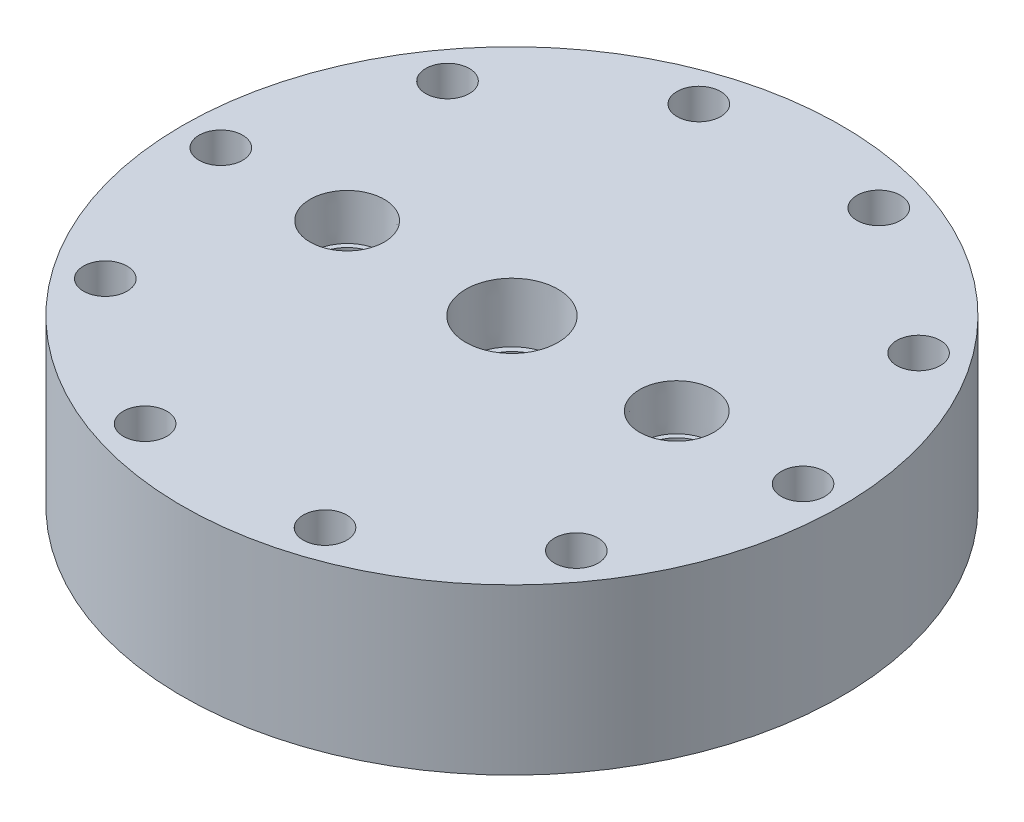
ISO-10303-21;
HEADER;
FILE_DESCRIPTION(('STEP AP214'),'2;1');
FILE_NAME('part.step','',(''),(''),'','','');
FILE_SCHEMA(('AUTOMOTIVE_DESIGN { 1 0 10303 214 1 1 1 1 }'));
ENDSEC;
DATA;
#1=APPLICATION_CONTEXT('core data for automotive mechanical design processes');
#2=APPLICATION_PROTOCOL_DEFINITION('international standard','automotive_design',2000,#1);
#3=PRODUCT_CONTEXT('',#1,'mechanical');
#4=PRODUCT('Part','Part','',(#3));
#5=PRODUCT_RELATED_PRODUCT_CATEGORY('part','',(#4));
#6=PRODUCT_DEFINITION_FORMATION('','',#4);
#7=PRODUCT_DEFINITION_CONTEXT('part definition',#1,'design');
#8=PRODUCT_DEFINITION('design','',#6,#7);
#9=PRODUCT_DEFINITION_SHAPE('','',#8);
#10=(LENGTH_UNIT() NAMED_UNIT(*) SI_UNIT(.MILLI.,.METRE.));
#11=(NAMED_UNIT(*) PLANE_ANGLE_UNIT() SI_UNIT($,.RADIAN.));
#12=(NAMED_UNIT(*) SI_UNIT($,.STERADIAN.) SOLID_ANGLE_UNIT());
#13=UNCERTAINTY_MEASURE_WITH_UNIT(LENGTH_MEASURE(1.E-05),#10,'distance_accuracy_value','');
#14=(GEOMETRIC_REPRESENTATION_CONTEXT(3) GLOBAL_UNCERTAINTY_ASSIGNED_CONTEXT((#13)) GLOBAL_UNIT_ASSIGNED_CONTEXT((#10,
#11,#12)) REPRESENTATION_CONTEXT('',''));
#15=CARTESIAN_POINT('',(0.,0.,0.));
#16=DIRECTION('',(0.,0.,1.));
#17=DIRECTION('',(1.,0.,0.));
#18=AXIS2_PLACEMENT_3D('',#15,#16,#17);
#19=CARTESIAN_POINT('',(-76.2,-38.1,0.));
#20=DIRECTION('',(0.,-1.,0.));
#21=DIRECTION('',(1.,0.,0.));
#22=AXIS2_PLACEMENT_3D('',#19,#20,#21);
#23=PLANE('',#22);
#24=CARTESIAN_POINT('',(54.4549338913782,-38.1,39.5638253318057));
#25=DIRECTION('',(0.,1.,0.));
#26=DIRECTION('',(0.,0.,1.));
#27=AXIS2_PLACEMENT_3D('',#24,#25,#26);
#28=CIRCLE('',#27,5.04189999999999);
#29=CARTESIAN_POINT('',(54.4549338913782,-38.1,44.6057253318056));
#30=VERTEX_POINT('',#29);
#31=EDGE_CURVE('E134',#30,#30,#28,.T.);
#32=ORIENTED_EDGE('',*,*,#31,.T.);
#33=EDGE_LOOP('',(#32));
#34=FACE_BOUND('',#33,.T.);
#35=CARTESIAN_POINT('',(20.7999338913784,-38.1,64.0156141118266));
#36=DIRECTION('',(0.,1.,0.));
#37=DIRECTION('',(0.,0.,1.));
#38=AXIS2_PLACEMENT_3D('',#35,#36,#37);
#39=CIRCLE('',#38,5.04189999999999);
#40=CARTESIAN_POINT('',(20.7999338913784,-38.1,69.0575141118265));
#41=VERTEX_POINT('',#40);
#42=EDGE_CURVE('E138',#41,#41,#39,.T.);
#43=ORIENTED_EDGE('',*,*,#42,.T.);
#44=EDGE_LOOP('',(#43));
#45=FACE_BOUND('',#44,.T.);
#46=CARTESIAN_POINT('',(-20.7999338913771,-38.1,64.015614111827));
#47=DIRECTION('',(0.,1.,0.));
#48=DIRECTION('',(0.,0.,1.));
#49=AXIS2_PLACEMENT_3D('',#46,#47,#48);
#50=CIRCLE('',#49,5.04189999999999);
#51=CARTESIAN_POINT('',(-20.7999338913771,-38.1,69.057514111827));
#52=VERTEX_POINT('',#51);
#53=EDGE_CURVE('E142',#52,#52,#50,.T.);
#54=ORIENTED_EDGE('',*,*,#53,.T.);
#55=EDGE_LOOP('',(#54));
#56=FACE_BOUND('',#55,.T.);
#57=CARTESIAN_POINT('',(-54.4549338913774,-38.1,39.5638253318068));
#58=DIRECTION('',(0.,1.,0.));
#59=DIRECTION('',(0.,0.,1.));
#60=AXIS2_PLACEMENT_3D('',#57,#58,#59);
#61=CIRCLE('',#60,5.04189999999999);
#62=CARTESIAN_POINT('',(-54.4549338913774,-38.1,44.6057253318068));
#63=VERTEX_POINT('',#62);
#64=EDGE_CURVE('E146',#63,#63,#61,.T.);
#65=ORIENTED_EDGE('',*,*,#64,.T.);
#66=EDGE_LOOP('',(#65));
#67=FACE_BOUND('',#66,.T.);
#68=CARTESIAN_POINT('',(-67.31,-38.1,0.));
#69=DIRECTION('',(0.,1.,0.));
#70=DIRECTION('',(0.,0.,1.));
#71=AXIS2_PLACEMENT_3D('',#68,#69,#70);
#72=CIRCLE('',#71,5.04189999999999);
#73=CARTESIAN_POINT('',(-67.31,-38.1,5.04189999999999));
#74=VERTEX_POINT('',#73);
#75=EDGE_CURVE('E150',#74,#74,#72,.T.);
#76=ORIENTED_EDGE('',*,*,#75,.T.);
#77=EDGE_LOOP('',(#76));
#78=FACE_BOUND('',#77,.T.);
#79=CARTESIAN_POINT('',(0.,-38.1,0.));
#80=DIRECTION('',(0.,1.,0.));
#81=DIRECTION('',(-1.,0.,0.));
#82=AXIS2_PLACEMENT_3D('',#79,#80,#81);
#83=CIRCLE('',#82,76.2);
#84=CARTESIAN_POINT('',(-76.2,-38.1,0.));
#85=VERTEX_POINT('',#84);
#86=EDGE_CURVE('E40',#85,#85,#83,.T.);
#87=ORIENTED_EDGE('',*,*,#86,.F.);
#88=EDGE_LOOP('',(#87));
#89=FACE_BOUND('',#88,.T.);
#90=CARTESIAN_POINT('',(0.,-38.1,0.));
#91=DIRECTION('',(0.,1.,0.));
#92=DIRECTION('',(-1.,0.,0.));
#93=AXIS2_PLACEMENT_3D('',#90,#91,#92);
#94=CIRCLE('',#93,60.96);
#95=CARTESIAN_POINT('',(-60.96,-38.1,0.));
#96=VERTEX_POINT('',#95);
#97=EDGE_CURVE('E10',#96,#96,#94,.T.);
#98=ORIENTED_EDGE('',*,*,#97,.T.);
#99=EDGE_LOOP('',(#98));
#100=FACE_BOUND('',#99,.T.);
#101=CARTESIAN_POINT('',(67.31,-38.1,0.));
#102=DIRECTION('',(0.,1.,0.));
#103=DIRECTION('',(0.,0.,1.));
#104=AXIS2_PLACEMENT_3D('',#101,#102,#103);
#105=CIRCLE('',#104,5.04189999999999);
#106=CARTESIAN_POINT('',(67.31,-38.1,5.04189999999999));
#107=VERTEX_POINT('',#106);
#108=EDGE_CURVE('E156',#107,#107,#105,.T.);
#109=ORIENTED_EDGE('',*,*,#108,.T.);
#110=EDGE_LOOP('',(#109));
#111=FACE_BOUND('',#110,.T.);
#112=CARTESIAN_POINT('',(54.4549338913777,-38.1,-39.5638253318064));
#113=DIRECTION('',(0.,1.,0.));
#114=DIRECTION('',(0.,0.,1.));
#115=AXIS2_PLACEMENT_3D('',#112,#113,#114);
#116=CIRCLE('',#115,5.04189999999999);
#117=CARTESIAN_POINT('',(54.4549338913777,-38.1,-34.5219253318065));
#118=VERTEX_POINT('',#117);
#119=EDGE_CURVE('E160',#118,#118,#116,.T.);
#120=ORIENTED_EDGE('',*,*,#119,.T.);
#121=EDGE_LOOP('',(#120));
#122=FACE_BOUND('',#121,.T.);
#123=CARTESIAN_POINT('',(20.7999338913775,-38.1,-64.0156141118268));
#124=DIRECTION('',(0.,1.,0.));
#125=DIRECTION('',(0.,0.,1.));
#126=AXIS2_PLACEMENT_3D('',#123,#124,#125);
#127=CIRCLE('',#126,5.04189999999999);
#128=CARTESIAN_POINT('',(20.7999338913775,-38.1,-58.9737141118269));
#129=VERTEX_POINT('',#128);
#130=EDGE_CURVE('E164',#129,#129,#127,.T.);
#131=ORIENTED_EDGE('',*,*,#130,.T.);
#132=EDGE_LOOP('',(#131));
#133=FACE_BOUND('',#132,.T.);
#134=CARTESIAN_POINT('',(-20.799933891378,-38.1,-64.0156141118267));
#135=DIRECTION('',(0.,1.,0.));
#136=DIRECTION('',(0.,0.,1.));
#137=AXIS2_PLACEMENT_3D('',#134,#135,#136);
#138=CIRCLE('',#137,5.04189999999999);
#139=CARTESIAN_POINT('',(-20.799933891378,-38.1,-58.9737141118267));
#140=VERTEX_POINT('',#139);
#141=EDGE_CURVE('E168',#140,#140,#138,.T.);
#142=ORIENTED_EDGE('',*,*,#141,.T.);
#143=EDGE_LOOP('',(#142));
#144=FACE_BOUND('',#143,.T.);
#145=CARTESIAN_POINT('',(-54.4549338913779,-38.1,-39.5638253318061));
#146=DIRECTION('',(0.,1.,0.));
#147=DIRECTION('',(0.,0.,1.));
#148=AXIS2_PLACEMENT_3D('',#145,#146,#147);
#149=CIRCLE('',#148,5.04189999999999);
#150=CARTESIAN_POINT('',(-54.4549338913779,-38.1,-34.5219253318061));
#151=VERTEX_POINT('',#150);
#152=EDGE_CURVE('E171',#151,#151,#149,.T.);
#153=ORIENTED_EDGE('',*,*,#152,.T.);
#154=EDGE_LOOP('',(#153));
#155=FACE_BOUND('',#154,.T.);
#156=ADVANCED_FACE('F32',(#34,#45,#56,#67,#78,#89,#100,#111,#122,#133,#144,#155),#23,.T.);
#157=CARTESIAN_POINT('',(0.,0.,0.));
#158=DIRECTION('',(0.,1.,0.));
#159=DIRECTION('',(-1.,0.,0.));
#160=AXIS2_PLACEMENT_3D('',#157,#158,#159);
#161=CYLINDRICAL_SURFACE('',#160,60.96);
#162=CARTESIAN_POINT('',(0.,-32.258,0.));
#163=DIRECTION('',(0.,1.,0.));
#164=DIRECTION('',(-1.,0.,0.));
#165=AXIS2_PLACEMENT_3D('',#162,#163,#164);
#166=CIRCLE('',#165,60.96);
#167=CARTESIAN_POINT('',(-60.96,-32.258,0.));
#168=VERTEX_POINT('',#167);
#169=EDGE_CURVE('E51',#168,#168,#166,.T.);
#170=ORIENTED_EDGE('',*,*,#169,.T.);
#171=EDGE_LOOP('',(#170));
#172=FACE_BOUND('',#171,.T.);
#173=ORIENTED_EDGE('',*,*,#97,.F.);
#174=EDGE_LOOP('',(#173));
#175=FACE_BOUND('',#174,.T.);
#176=ADVANCED_FACE('F34',(#172,#175),#161,.F.);
#177=CARTESIAN_POINT('',(0.,0.,0.));
#178=DIRECTION('',(0.,1.,0.));
#179=DIRECTION('',(-1.,0.,0.));
#180=AXIS2_PLACEMENT_3D('',#177,#178,#179);
#181=CYLINDRICAL_SURFACE('',#180,76.2);
#182=ORIENTED_EDGE('',*,*,#86,.T.);
#183=EDGE_LOOP('',(#182));
#184=FACE_BOUND('',#183,.T.);
#185=CARTESIAN_POINT('',(0.,0.,0.));
#186=DIRECTION('',(0.,1.,0.));
#187=DIRECTION('',(-1.,0.,0.));
#188=AXIS2_PLACEMENT_3D('',#185,#186,#187);
#189=CIRCLE('',#188,76.2);
#190=CARTESIAN_POINT('',(-76.2,0.,0.));
#191=VERTEX_POINT('',#190);
#192=EDGE_CURVE('E45',#191,#191,#189,.T.);
#193=ORIENTED_EDGE('',*,*,#192,.F.);
#194=EDGE_LOOP('',(#193));
#195=FACE_BOUND('',#194,.T.);
#196=ADVANCED_FACE('F115',(#184,#195),#181,.T.);
#197=CARTESIAN_POINT('',(0.,0.,0.));
#198=DIRECTION('',(0.,1.,0.));
#199=DIRECTION('',(-1.,0.,0.));
#200=AXIS2_PLACEMENT_3D('',#197,#198,#199);
#201=PLANE('',#200);
#202=CARTESIAN_POINT('',(54.4549338913782,0.,39.5638253318057));
#203=DIRECTION('',(0.,1.,0.));
#204=DIRECTION('',(0.,0.,1.));
#205=AXIS2_PLACEMENT_3D('',#202,#203,#204);
#206=CIRCLE('',#205,5.04189999999999);
#207=CARTESIAN_POINT('',(54.4549338913782,0.,44.6057253318056));
#208=VERTEX_POINT('',#207);
#209=EDGE_CURVE('E393',#208,#208,#206,.T.);
#210=ORIENTED_EDGE('',*,*,#209,.F.);
#211=EDGE_LOOP('',(#210));
#212=FACE_BOUND('',#211,.T.);
#213=CARTESIAN_POINT('',(20.7999338913784,0.,64.0156141118266));
#214=DIRECTION('',(0.,1.,0.));
#215=DIRECTION('',(0.,0.,1.));
#216=AXIS2_PLACEMENT_3D('',#213,#214,#215);
#217=CIRCLE('',#216,5.04189999999999);
#218=CARTESIAN_POINT('',(20.7999338913784,0.,69.0575141118265));
#219=VERTEX_POINT('',#218);
#220=EDGE_CURVE('E408',#219,#219,#217,.T.);
#221=ORIENTED_EDGE('',*,*,#220,.F.);
#222=EDGE_LOOP('',(#221));
#223=FACE_BOUND('',#222,.T.);
#224=CARTESIAN_POINT('',(-20.7999338913771,0.,64.015614111827));
#225=DIRECTION('',(0.,1.,0.));
#226=DIRECTION('',(0.,0.,1.));
#227=AXIS2_PLACEMENT_3D('',#224,#225,#226);
#228=CIRCLE('',#227,5.04189999999999);
#229=CARTESIAN_POINT('',(-20.7999338913771,0.,69.057514111827));
#230=VERTEX_POINT('',#229);
#231=EDGE_CURVE('E412',#230,#230,#228,.T.);
#232=ORIENTED_EDGE('',*,*,#231,.F.);
#233=EDGE_LOOP('',(#232));
#234=FACE_BOUND('',#233,.T.);
#235=CARTESIAN_POINT('',(-54.4549338913774,0.,39.5638253318068));
#236=DIRECTION('',(0.,1.,0.));
#237=DIRECTION('',(0.,0.,1.));
#238=AXIS2_PLACEMENT_3D('',#235,#236,#237);
#239=CIRCLE('',#238,5.04189999999999);
#240=CARTESIAN_POINT('',(-54.4549338913774,0.,44.6057253318068));
#241=VERTEX_POINT('',#240);
#242=EDGE_CURVE('E416',#241,#241,#239,.T.);
#243=ORIENTED_EDGE('',*,*,#242,.F.);
#244=EDGE_LOOP('',(#243));
#245=FACE_BOUND('',#244,.T.);
#246=CARTESIAN_POINT('',(-67.31,0.,0.));
#247=DIRECTION('',(0.,1.,0.));
#248=DIRECTION('',(0.,0.,1.));
#249=AXIS2_PLACEMENT_3D('',#246,#247,#248);
#250=CIRCLE('',#249,5.04189999999999);
#251=CARTESIAN_POINT('',(-67.31,0.,5.04189999999999));
#252=VERTEX_POINT('',#251);
#253=EDGE_CURVE('E420',#252,#252,#250,.T.);
#254=ORIENTED_EDGE('',*,*,#253,.F.);
#255=EDGE_LOOP('',(#254));
#256=FACE_BOUND('',#255,.T.);
#257=CARTESIAN_POINT('',(-54.4549338913779,0.,-39.5638253318061));
#258=DIRECTION('',(0.,1.,0.));
#259=DIRECTION('',(0.,0.,1.));
#260=AXIS2_PLACEMENT_3D('',#257,#258,#259);
#261=CIRCLE('',#260,5.04189999999999);
#262=CARTESIAN_POINT('',(-54.4549338913779,0.,-34.5219253318061));
#263=VERTEX_POINT('',#262);
#264=EDGE_CURVE('E174',#263,#263,#261,.T.);
#265=ORIENTED_EDGE('',*,*,#264,.F.);
#266=EDGE_LOOP('',(#265));
#267=FACE_BOUND('',#266,.T.);
#268=CARTESIAN_POINT('',(-20.799933891378,0.,-64.0156141118267));
#269=DIRECTION('',(0.,1.,0.));
#270=DIRECTION('',(0.,0.,1.));
#271=AXIS2_PLACEMENT_3D('',#268,#269,#270);
#272=CIRCLE('',#271,5.04189999999999);
#273=CARTESIAN_POINT('',(-20.799933891378,0.,-58.9737141118267));
#274=VERTEX_POINT('',#273);
#275=EDGE_CURVE('E173',#274,#274,#272,.T.);
#276=ORIENTED_EDGE('',*,*,#275,.F.);
#277=EDGE_LOOP('',(#276));
#278=FACE_BOUND('',#277,.T.);
#279=CARTESIAN_POINT('',(20.7999338913775,0.,-64.0156141118268));
#280=DIRECTION('',(0.,1.,0.));
#281=DIRECTION('',(0.,0.,1.));
#282=AXIS2_PLACEMENT_3D('',#279,#280,#281);
#283=CIRCLE('',#282,5.04189999999999);
#284=CARTESIAN_POINT('',(20.7999338913775,0.,-58.9737141118269));
#285=VERTEX_POINT('',#284);
#286=EDGE_CURVE('E183',#285,#285,#283,.T.);
#287=ORIENTED_EDGE('',*,*,#286,.F.);
#288=EDGE_LOOP('',(#287));
#289=FACE_BOUND('',#288,.T.);
#290=CARTESIAN_POINT('',(54.4549338913777,0.,-39.5638253318064));
#291=DIRECTION('',(0.,1.,0.));
#292=DIRECTION('',(0.,0.,1.));
#293=AXIS2_PLACEMENT_3D('',#290,#291,#292);
#294=CIRCLE('',#293,5.04189999999999);
#295=CARTESIAN_POINT('',(54.4549338913777,0.,-34.5219253318065));
#296=VERTEX_POINT('',#295);
#297=EDGE_CURVE('E187',#296,#296,#294,.T.);
#298=ORIENTED_EDGE('',*,*,#297,.F.);
#299=EDGE_LOOP('',(#298));
#300=FACE_BOUND('',#299,.T.);
#301=CARTESIAN_POINT('',(67.31,0.,0.));
#302=DIRECTION('',(0.,1.,0.));
#303=DIRECTION('',(0.,0.,1.));
#304=AXIS2_PLACEMENT_3D('',#301,#302,#303);
#305=CIRCLE('',#304,5.0419);
#306=CARTESIAN_POINT('',(67.31,0.,5.0419));
#307=VERTEX_POINT('',#306);
#308=EDGE_CURVE('E191',#307,#307,#305,.T.);
#309=ORIENTED_EDGE('',*,*,#308,.F.);
#310=EDGE_LOOP('',(#309));
#311=FACE_BOUND('',#310,.T.);
#312=CARTESIAN_POINT('',(-38.1,0.,0.));
#313=DIRECTION('',(0.,1.,0.));
#314=DIRECTION('',(0.,0.,1.));
#315=AXIS2_PLACEMENT_3D('',#312,#313,#314);
#316=CIRCLE('',#315,8.5750146);
#317=CARTESIAN_POINT('',(-38.1,0.,8.5750146));
#318=VERTEX_POINT('',#317);
#319=EDGE_CURVE('E195',#318,#318,#316,.T.);
#320=ORIENTED_EDGE('',*,*,#319,.F.);
#321=EDGE_LOOP('',(#320));
#322=FACE_BOUND('',#321,.T.);
#323=CARTESIAN_POINT('',(38.1,0.,0.));
#324=DIRECTION('',(0.,1.,0.));
#325=DIRECTION('',(0.,0.,1.));
#326=AXIS2_PLACEMENT_3D('',#323,#324,#325);
#327=CIRCLE('',#326,8.5750146);
#328=CARTESIAN_POINT('',(38.1,0.,8.5750146));
#329=VERTEX_POINT('',#328);
#330=EDGE_CURVE('E68',#329,#329,#327,.T.);
#331=ORIENTED_EDGE('',*,*,#330,.F.);
#332=EDGE_LOOP('',(#331));
#333=FACE_BOUND('',#332,.T.);
#334=CARTESIAN_POINT('',(0.,0.,0.));
#335=DIRECTION('',(0.,1.,0.));
#336=DIRECTION('',(0.,0.,1.));
#337=AXIS2_PLACEMENT_3D('',#334,#335,#336);
#338=CIRCLE('',#337,10.6647361);
#339=CARTESIAN_POINT('',(0.,0.,10.6647361));
#340=VERTEX_POINT('',#339);
#341=EDGE_CURVE('E55',#340,#340,#338,.T.);
#342=ORIENTED_EDGE('',*,*,#341,.F.);
#343=EDGE_LOOP('',(#342));
#344=FACE_BOUND('',#343,.T.);
#345=ORIENTED_EDGE('',*,*,#192,.T.);
#346=EDGE_LOOP('',(#345));
#347=FACE_BOUND('',#346,.T.);
#348=ADVANCED_FACE('F113',(#212,#223,#234,#245,#256,#267,#278,#289,#300,#311,#322,#333,#344,
#347),#201,.T.);
#349=CARTESIAN_POINT('',(0.,-27.178,0.));
#350=DIRECTION('',(0.,-1.,0.));
#351=DIRECTION('',(1.,0.,0.));
#352=AXIS2_PLACEMENT_3D('',#349,#350,#351);
#353=CONICAL_SURFACE('',#352,22.225,1.09967971244947);
#354=CARTESIAN_POINT('',(0.,-20.4049390514286,0.));
#355=DIRECTION('',(0.,-1.,0.));
#356=DIRECTION('',(1.,0.,0.));
#357=AXIS2_PLACEMENT_3D('',#354,#355,#356);
#358=CIRCLE('',#357,8.9281);
#359=CARTESIAN_POINT('',(8.9281,-20.4049390514286,0.));
#360=VERTEX_POINT('',#359);
#361=EDGE_CURVE('E49',#360,#360,#358,.T.);
#362=ORIENTED_EDGE('',*,*,#361,.F.);
#363=EDGE_LOOP('',(#362));
#364=FACE_BOUND('',#363,.T.);
#365=CARTESIAN_POINT('',(0.,-27.178,0.));
#366=DIRECTION('',(0.,1.,0.));
#367=DIRECTION('',(-1.,0.,0.));
#368=AXIS2_PLACEMENT_3D('',#365,#366,#367);
#369=CIRCLE('',#368,22.225);
#370=CARTESIAN_POINT('',(-22.225,-27.178,0.));
#371=VERTEX_POINT('',#370);
#372=EDGE_CURVE('E108',#371,#371,#369,.T.);
#373=ORIENTED_EDGE('',*,*,#372,.F.);
#374=EDGE_LOOP('',(#373));
#375=FACE_BOUND('',#374,.T.);
#376=ADVANCED_FACE('F123',(#364,#375),#353,.F.);
#377=CARTESIAN_POINT('',(-24.0284,-27.178,0.));
#378=DIRECTION('',(0.,-1.,0.));
#379=DIRECTION('',(1.,0.,0.));
#380=AXIS2_PLACEMENT_3D('',#377,#378,#379);
#381=PLANE('',#380);
#382=ORIENTED_EDGE('',*,*,#372,.T.);
#383=EDGE_LOOP('',(#382));
#384=FACE_BOUND('',#383,.T.);
#385=CARTESIAN_POINT('',(0.,-27.178,0.));
#386=DIRECTION('',(0.,1.,0.));
#387=DIRECTION('',(-1.,0.,0.));
#388=AXIS2_PLACEMENT_3D('',#385,#386,#387);
#389=CIRCLE('',#388,24.0284);
#390=CARTESIAN_POINT('',(-24.0284,-27.178,0.));
#391=VERTEX_POINT('',#390);
#392=EDGE_CURVE('E105',#391,#391,#389,.T.);
#393=ORIENTED_EDGE('',*,*,#392,.F.);
#394=EDGE_LOOP('',(#393));
#395=FACE_BOUND('',#394,.T.);
#396=ADVANCED_FACE('F274',(#384,#395),#381,.T.);
#397=CARTESIAN_POINT('',(0.,0.,0.));
#398=DIRECTION('',(0.,1.,0.));
#399=DIRECTION('',(-1.,0.,0.));
#400=AXIS2_PLACEMENT_3D('',#397,#398,#399);
#401=CYLINDRICAL_SURFACE('',#400,24.0284);
#402=ORIENTED_EDGE('',*,*,#392,.T.);
#403=EDGE_LOOP('',(#402));
#404=FACE_BOUND('',#403,.T.);
#405=CARTESIAN_POINT('',(0.,-24.4856,0.));
#406=DIRECTION('',(0.,1.,0.));
#407=DIRECTION('',(-1.,0.,0.));
#408=AXIS2_PLACEMENT_3D('',#405,#406,#407);
#409=CIRCLE('',#408,24.0284);
#410=CARTESIAN_POINT('',(-24.0284,-24.4856,0.));
#411=VERTEX_POINT('',#410);
#412=EDGE_CURVE('E102',#411,#411,#409,.T.);
#413=ORIENTED_EDGE('',*,*,#412,.F.);
#414=EDGE_LOOP('',(#413));
#415=FACE_BOUND('',#414,.T.);
#416=ADVANCED_FACE('F270',(#404,#415),#401,.T.);
#417=CARTESIAN_POINT('',(-28.0924,-24.4856,0.));
#418=DIRECTION('',(0.,-1.,0.));
#419=DIRECTION('',(1.,0.,0.));
#420=AXIS2_PLACEMENT_3D('',#417,#418,#419);
#421=PLANE('',#420);
#422=ORIENTED_EDGE('',*,*,#412,.T.);
#423=EDGE_LOOP('',(#422));
#424=FACE_BOUND('',#423,.T.);
#425=CARTESIAN_POINT('',(0.,-24.4856,0.));
#426=DIRECTION('',(0.,1.,0.));
#427=DIRECTION('',(-1.,0.,0.));
#428=AXIS2_PLACEMENT_3D('',#425,#426,#427);
#429=CIRCLE('',#428,28.0924);
#430=CARTESIAN_POINT('',(-28.0924,-24.4856,0.));
#431=VERTEX_POINT('',#430);
#432=EDGE_CURVE('E99',#431,#431,#429,.T.);
#433=ORIENTED_EDGE('',*,*,#432,.F.);
#434=EDGE_LOOP('',(#433));
#435=FACE_BOUND('',#434,.T.);
#436=ADVANCED_FACE('F266',(#424,#435),#421,.T.);
#437=CARTESIAN_POINT('',(0.,0.,0.));
#438=DIRECTION('',(0.,1.,0.));
#439=DIRECTION('',(-1.,0.,0.));
#440=AXIS2_PLACEMENT_3D('',#437,#438,#439);
#441=CYLINDRICAL_SURFACE('',#440,28.0924);
#442=ORIENTED_EDGE('',*,*,#432,.T.);
#443=EDGE_LOOP('',(#442));
#444=FACE_BOUND('',#443,.T.);
#445=CARTESIAN_POINT('',(0.,-27.178,0.));
#446=DIRECTION('',(0.,1.,0.));
#447=DIRECTION('',(-1.,0.,0.));
#448=AXIS2_PLACEMENT_3D('',#445,#446,#447);
#449=CIRCLE('',#448,28.0924);
#450=CARTESIAN_POINT('',(-28.0924,-27.178,0.));
#451=VERTEX_POINT('',#450);
#452=EDGE_CURVE('E96',#451,#451,#449,.T.);
#453=ORIENTED_EDGE('',*,*,#452,.F.);
#454=EDGE_LOOP('',(#453));
#455=FACE_BOUND('',#454,.T.);
#456=ADVANCED_FACE('F262',(#444,#455),#441,.F.);
#457=CARTESIAN_POINT('',(-28.575,-27.178,0.));
#458=DIRECTION('',(0.,-1.,0.));
#459=DIRECTION('',(1.,0.,0.));
#460=AXIS2_PLACEMENT_3D('',#457,#458,#459);
#461=PLANE('',#460);
#462=ORIENTED_EDGE('',*,*,#452,.T.);
#463=EDGE_LOOP('',(#462));
#464=FACE_BOUND('',#463,.T.);
#465=CARTESIAN_POINT('',(0.,-27.178,0.));
#466=DIRECTION('',(0.,1.,0.));
#467=DIRECTION('',(-1.,0.,0.));
#468=AXIS2_PLACEMENT_3D('',#465,#466,#467);
#469=CIRCLE('',#468,28.575);
#470=CARTESIAN_POINT('',(-28.575,-27.178,0.));
#471=VERTEX_POINT('',#470);
#472=EDGE_CURVE('E93',#471,#471,#469,.T.);
#473=ORIENTED_EDGE('',*,*,#472,.F.);
#474=EDGE_LOOP('',(#473));
#475=FACE_BOUND('',#474,.T.);
#476=ADVANCED_FACE('F258',(#464,#475),#461,.T.);
#477=CARTESIAN_POINT('',(0.,0.,0.));
#478=DIRECTION('',(0.,1.,0.));
#479=DIRECTION('',(-1.,0.,0.));
#480=AXIS2_PLACEMENT_3D('',#477,#478,#479);
#481=CYLINDRICAL_SURFACE('',#480,28.575);
#482=ORIENTED_EDGE('',*,*,#472,.T.);
#483=EDGE_LOOP('',(#482));
#484=FACE_BOUND('',#483,.T.);
#485=CARTESIAN_POINT('',(0.,-32.258,0.));
#486=DIRECTION('',(0.,1.,0.));
#487=DIRECTION('',(-1.,0.,0.));
#488=AXIS2_PLACEMENT_3D('',#485,#486,#487);
#489=CIRCLE('',#488,28.575);
#490=CARTESIAN_POINT('',(-28.575,-32.258,0.));
#491=VERTEX_POINT('',#490);
#492=EDGE_CURVE('E90',#491,#491,#489,.T.);
#493=ORIENTED_EDGE('',*,*,#492,.F.);
#494=EDGE_LOOP('',(#493));
#495=FACE_BOUND('',#494,.T.);
#496=ADVANCED_FACE('F216',(#484,#495),#481,.F.);
#497=CARTESIAN_POINT('',(-51.6509,-32.258,0.));
#498=DIRECTION('',(0.,-1.,0.));
#499=DIRECTION('',(1.,0.,0.));
#500=AXIS2_PLACEMENT_3D('',#497,#498,#499);
#501=PLANE('',#500);
#502=CARTESIAN_POINT('',(0.,-32.258,44.45));
#503=DIRECTION('',(0.,-1.,0.));
#504=DIRECTION('',(1.,0.,0.));
#505=AXIS2_PLACEMENT_3D('',#502,#503,#504);
#506=CIRCLE('',#505,1.27);
#507=CARTESIAN_POINT('',(1.27,-32.258,44.45));
#508=VERTEX_POINT('',#507);
#509=EDGE_CURVE('E394',#508,#508,#506,.T.);
#510=ORIENTED_EDGE('',*,*,#509,.F.);
#511=EDGE_LOOP('',(#510));
#512=FACE_BOUND('',#511,.T.);
#513=CARTESIAN_POINT('',(0.,-32.258,-44.45));
#514=DIRECTION('',(0.,-1.,0.));
#515=DIRECTION('',(1.,0.,0.));
#516=AXIS2_PLACEMENT_3D('',#513,#514,#515);
#517=CIRCLE('',#516,1.27);
#518=CARTESIAN_POINT('',(1.27,-32.258,-44.45));
#519=VERTEX_POINT('',#518);
#520=EDGE_CURVE('E404',#519,#519,#517,.T.);
#521=ORIENTED_EDGE('',*,*,#520,.F.);
#522=EDGE_LOOP('',(#521));
#523=FACE_BOUND('',#522,.T.);
#524=CARTESIAN_POINT('',(-38.1,-32.258,0.));
#525=DIRECTION('',(0.,-1.,0.));
#526=DIRECTION('',(1.,0.,0.));
#527=AXIS2_PLACEMENT_3D('',#524,#525,#526);
#528=CIRCLE('',#527,7.1374);
#529=CARTESIAN_POINT('',(-30.9626,-32.258,0.));
#530=VERTEX_POINT('',#529);
#531=EDGE_CURVE('E36',#530,#530,#528,.T.);
#532=ORIENTED_EDGE('',*,*,#531,.F.);
#533=EDGE_LOOP('',(#532));
#534=FACE_BOUND('',#533,.T.);
#535=CARTESIAN_POINT('',(38.1,-32.258,0.));
#536=DIRECTION('',(0.,-1.,0.));
#537=DIRECTION('',(1.,0.,0.));
#538=AXIS2_PLACEMENT_3D('',#535,#536,#537);
#539=CIRCLE('',#538,7.13740000000001);
#540=CARTESIAN_POINT('',(45.2374,-32.258,0.));
#541=VERTEX_POINT('',#540);
#542=EDGE_CURVE('E53',#541,#541,#539,.T.);
#543=ORIENTED_EDGE('',*,*,#542,.F.);
#544=EDGE_LOOP('',(#543));
#545=FACE_BOUND('',#544,.T.);
#546=ORIENTED_EDGE('',*,*,#492,.T.);
#547=EDGE_LOOP('',(#546));
#548=FACE_BOUND('',#547,.T.);
#549=CARTESIAN_POINT('',(0.,-32.258,0.));
#550=DIRECTION('',(0.,1.,0.));
#551=DIRECTION('',(-1.,0.,0.));
#552=AXIS2_PLACEMENT_3D('',#549,#550,#551);
#553=CIRCLE('',#552,51.6509);
#554=CARTESIAN_POINT('',(-51.6509,-32.258,0.));
#555=VERTEX_POINT('',#554);
#556=EDGE_CURVE('E87',#555,#555,#553,.T.);
#557=ORIENTED_EDGE('',*,*,#556,.F.);
#558=EDGE_LOOP('',(#557));
#559=FACE_BOUND('',#558,.T.);
#560=ADVANCED_FACE('F212',(#512,#523,#534,#545,#548,#559),#501,.T.);
#561=CARTESIAN_POINT('',(0.,0.,0.));
#562=DIRECTION('',(0.,1.,0.));
#563=DIRECTION('',(-1.,0.,0.));
#564=AXIS2_PLACEMENT_3D('',#561,#562,#563);
#565=CYLINDRICAL_SURFACE('',#564,51.6509);
#566=ORIENTED_EDGE('',*,*,#556,.T.);
#567=EDGE_LOOP('',(#566));
#568=FACE_BOUND('',#567,.T.);
#569=CARTESIAN_POINT('',(0.,-29.5656,0.));
#570=DIRECTION('',(0.,1.,0.));
#571=DIRECTION('',(-1.,0.,0.));
#572=AXIS2_PLACEMENT_3D('',#569,#570,#571);
#573=CIRCLE('',#572,51.6509);
#574=CARTESIAN_POINT('',(-51.6509,-29.5656,0.));
#575=VERTEX_POINT('',#574);
#576=EDGE_CURVE('E84',#575,#575,#573,.T.);
#577=ORIENTED_EDGE('',*,*,#576,.F.);
#578=EDGE_LOOP('',(#577));
#579=FACE_BOUND('',#578,.T.);
#580=ADVANCED_FACE('F215',(#568,#579),#565,.T.);
#581=CARTESIAN_POINT('',(-55.7149,-29.5656,0.));
#582=DIRECTION('',(0.,-1.,0.));
#583=DIRECTION('',(1.,0.,0.));
#584=AXIS2_PLACEMENT_3D('',#581,#582,#583);
#585=PLANE('',#584);
#586=ORIENTED_EDGE('',*,*,#576,.T.);
#587=EDGE_LOOP('',(#586));
#588=FACE_BOUND('',#587,.T.);
#589=CARTESIAN_POINT('',(0.,-29.5656,0.));
#590=DIRECTION('',(0.,1.,0.));
#591=DIRECTION('',(-1.,0.,0.));
#592=AXIS2_PLACEMENT_3D('',#589,#590,#591);
#593=CIRCLE('',#592,55.7149);
#594=CARTESIAN_POINT('',(-55.7149,-29.5656,0.));
#595=VERTEX_POINT('',#594);
#596=EDGE_CURVE('E81',#595,#595,#593,.T.);
#597=ORIENTED_EDGE('',*,*,#596,.F.);
#598=EDGE_LOOP('',(#597));
#599=FACE_BOUND('',#598,.T.);
#600=ADVANCED_FACE('F226',(#588,#599),#585,.T.);
#601=CARTESIAN_POINT('',(0.,0.,0.));
#602=DIRECTION('',(0.,1.,0.));
#603=DIRECTION('',(-1.,0.,0.));
#604=AXIS2_PLACEMENT_3D('',#601,#602,#603);
#605=CYLINDRICAL_SURFACE('',#604,55.7149);
#606=ORIENTED_EDGE('',*,*,#596,.T.);
#607=EDGE_LOOP('',(#606));
#608=FACE_BOUND('',#607,.T.);
#609=CARTESIAN_POINT('',(0.,-32.258,0.));
#610=DIRECTION('',(0.,1.,0.));
#611=DIRECTION('',(-1.,0.,0.));
#612=AXIS2_PLACEMENT_3D('',#609,#610,#611);
#613=CIRCLE('',#612,55.7149);
#614=CARTESIAN_POINT('',(-55.7149,-32.258,0.));
#615=VERTEX_POINT('',#614);
#616=EDGE_CURVE('E78',#615,#615,#613,.T.);
#617=ORIENTED_EDGE('',*,*,#616,.F.);
#618=EDGE_LOOP('',(#617));
#619=FACE_BOUND('',#618,.T.);
#620=ADVANCED_FACE('F232',(#608,#619),#605,.F.);
#621=CARTESIAN_POINT('',(-60.96,-32.258,0.));
#622=DIRECTION('',(0.,-1.,0.));
#623=DIRECTION('',(1.,0.,0.));
#624=AXIS2_PLACEMENT_3D('',#621,#622,#623);
#625=PLANE('',#624);
#626=ORIENTED_EDGE('',*,*,#616,.T.);
#627=EDGE_LOOP('',(#626));
#628=FACE_BOUND('',#627,.T.);
#629=ORIENTED_EDGE('',*,*,#169,.F.);
#630=EDGE_LOOP('',(#629));
#631=FACE_BOUND('',#630,.T.);
#632=ADVANCED_FACE('F238',(#628,#631),#625,.T.);
#633=CARTESIAN_POINT('',(0.,0.,0.));
#634=DIRECTION('',(0.,1.,0.));
#635=DIRECTION('',(0.,0.,1.));
#636=AXIS2_PLACEMENT_3D('',#633,#634,#635);
#637=CYLINDRICAL_SURFACE('',#636,8.9281);
#638=ORIENTED_EDGE('',*,*,#361,.T.);
#639=EDGE_LOOP('',(#638));
#640=FACE_BOUND('',#639,.T.);
#641=CARTESIAN_POINT('',(0.,-13.462,0.));
#642=DIRECTION('',(0.,1.,0.));
#643=DIRECTION('',(0.,0.,1.));
#644=AXIS2_PLACEMENT_3D('',#641,#642,#643);
#645=CIRCLE('',#644,8.9281);
#646=CARTESIAN_POINT('',(0.,-13.462,8.9281));
#647=VERTEX_POINT('',#646);
#648=EDGE_CURVE('E52',#647,#647,#645,.T.);
#649=ORIENTED_EDGE('',*,*,#648,.T.);
#650=EDGE_LOOP('',(#649));
#651=FACE_BOUND('',#650,.T.);
#652=ADVANCED_FACE('F244',(#640,#651),#637,.F.);
#653=CARTESIAN_POINT('',(8.9281,-13.462,0.));
#654=DIRECTION('',(0.,-1.,0.));
#655=DIRECTION('',(0.,0.,-1.));
#656=AXIS2_PLACEMENT_3D('',#653,#654,#655);
#657=PLANE('',#656);
#658=ORIENTED_EDGE('',*,*,#648,.F.);
#659=EDGE_LOOP('',(#658));
#660=FACE_BOUND('',#659,.T.);
#661=CARTESIAN_POINT('',(0.,-13.462,0.));
#662=DIRECTION('',(0.,1.,0.));
#663=DIRECTION('',(0.,0.,1.));
#664=AXIS2_PLACEMENT_3D('',#661,#662,#663);
#665=CIRCLE('',#664,10.2616657920863);
#666=CARTESIAN_POINT('',(0.,-13.462,10.2616657920863));
#667=VERTEX_POINT('',#666);
#668=EDGE_CURVE('E60',#667,#667,#665,.T.);
#669=ORIENTED_EDGE('',*,*,#668,.T.);
#670=EDGE_LOOP('',(#669));
#671=FACE_BOUND('',#670,.T.);
#672=ADVANCED_FACE('F251',(#660,#671),#657,.F.);
#673=CARTESIAN_POINT('',(0.,0.,0.));
#674=DIRECTION('',(0.,1.,0.));
#675=DIRECTION('',(0.,0.,1.));
#676=AXIS2_PLACEMENT_3D('',#673,#674,#675);
#677=CONICAL_SURFACE('',#676,10.6647361,0.0299323966717028);
#678=ORIENTED_EDGE('',*,*,#668,.F.);
#679=EDGE_LOOP('',(#678));
#680=FACE_BOUND('',#679,.T.);
#681=ORIENTED_EDGE('',*,*,#341,.T.);
#682=EDGE_LOOP('',(#681));
#683=FACE_BOUND('',#682,.T.);
#684=ADVANCED_FACE('F302',(#680,#683),#677,.F.);
#685=CARTESIAN_POINT('',(38.1,0.,0.));
#686=DIRECTION('',(0.,1.,0.));
#687=DIRECTION('',(0.,0.,1.));
#688=AXIS2_PLACEMENT_3D('',#685,#686,#687);
#689=CYLINDRICAL_SURFACE('',#688,7.13740000000001);
#690=ORIENTED_EDGE('',*,*,#542,.T.);
#691=EDGE_LOOP('',(#690));
#692=FACE_BOUND('',#691,.T.);
#693=CARTESIAN_POINT('',(38.1,-10.414,0.));
#694=DIRECTION('',(0.,1.,0.));
#695=DIRECTION('',(0.,0.,1.));
#696=AXIS2_PLACEMENT_3D('',#693,#694,#695);
#697=CIRCLE('',#696,7.1374);
#698=CARTESIAN_POINT('',(38.1,-10.414,7.1374));
#699=VERTEX_POINT('',#698);
#700=EDGE_CURVE('E56',#699,#699,#697,.T.);
#701=ORIENTED_EDGE('',*,*,#700,.T.);
#702=EDGE_LOOP('',(#701));
#703=FACE_BOUND('',#702,.T.);
#704=ADVANCED_FACE('F307',(#692,#703),#689,.F.);
#705=CARTESIAN_POINT('',(45.2374,-10.414,0.));
#706=DIRECTION('',(0.,-1.,0.));
#707=DIRECTION('',(0.,0.,-1.));
#708=AXIS2_PLACEMENT_3D('',#705,#706,#707);
#709=PLANE('',#708);
#710=ORIENTED_EDGE('',*,*,#700,.F.);
#711=EDGE_LOOP('',(#710));
#712=FACE_BOUND('',#711,.T.);
#713=CARTESIAN_POINT('',(38.1,-10.414,0.));
#714=DIRECTION('',(0.,1.,0.));
#715=DIRECTION('',(0.,0.,1.));
#716=AXIS2_PLACEMENT_3D('',#713,#714,#715);
#717=CIRCLE('',#716,8.26320549387809);
#718=CARTESIAN_POINT('',(38.1,-10.414,8.26320549387809));
#719=VERTEX_POINT('',#718);
#720=EDGE_CURVE('E63',#719,#719,#717,.T.);
#721=ORIENTED_EDGE('',*,*,#720,.T.);
#722=EDGE_LOOP('',(#721));
#723=FACE_BOUND('',#722,.T.);
#724=ADVANCED_FACE('F314',(#712,#723),#709,.F.);
#725=CARTESIAN_POINT('',(38.1,0.,0.));
#726=DIRECTION('',(0.,1.,0.));
#727=DIRECTION('',(0.,0.,1.));
#728=AXIS2_PLACEMENT_3D('',#725,#726,#727);
#729=CONICAL_SURFACE('',#728,8.5750146,0.0299323966717029);
#730=ORIENTED_EDGE('',*,*,#720,.F.);
#731=EDGE_LOOP('',(#730));
#732=FACE_BOUND('',#731,.T.);
#733=ORIENTED_EDGE('',*,*,#330,.T.);
#734=EDGE_LOOP('',(#733));
#735=FACE_BOUND('',#734,.T.);
#736=ADVANCED_FACE('F319',(#732,#735),#729,.F.);
#737=CARTESIAN_POINT('',(-38.1,0.,0.));
#738=DIRECTION('',(0.,1.,0.));
#739=DIRECTION('',(0.,0.,1.));
#740=AXIS2_PLACEMENT_3D('',#737,#738,#739);
#741=CYLINDRICAL_SURFACE('',#740,7.1374);
#742=ORIENTED_EDGE('',*,*,#531,.T.);
#743=EDGE_LOOP('',(#742));
#744=FACE_BOUND('',#743,.T.);
#745=CARTESIAN_POINT('',(-38.1,-10.414,0.));
#746=DIRECTION('',(0.,1.,0.));
#747=DIRECTION('',(0.,0.,1.));
#748=AXIS2_PLACEMENT_3D('',#745,#746,#747);
#749=CIRCLE('',#748,7.1374);
#750=CARTESIAN_POINT('',(-38.1,-10.414,7.1374));
#751=VERTEX_POINT('',#750);
#752=EDGE_CURVE('E201',#751,#751,#749,.T.);
#753=ORIENTED_EDGE('',*,*,#752,.T.);
#754=EDGE_LOOP('',(#753));
#755=FACE_BOUND('',#754,.T.);
#756=ADVANCED_FACE('F209',(#744,#755),#741,.F.);
#757=CARTESIAN_POINT('',(-30.9626,-10.414,0.));
#758=DIRECTION('',(0.,-1.,0.));
#759=DIRECTION('',(0.,0.,-1.));
#760=AXIS2_PLACEMENT_3D('',#757,#758,#759);
#761=PLANE('',#760);
#762=ORIENTED_EDGE('',*,*,#752,.F.);
#763=EDGE_LOOP('',(#762));
#764=FACE_BOUND('',#763,.T.);
#765=CARTESIAN_POINT('',(-38.1,-10.414,0.));
#766=DIRECTION('',(0.,1.,0.));
#767=DIRECTION('',(0.,0.,1.));
#768=AXIS2_PLACEMENT_3D('',#765,#766,#767);
#769=CIRCLE('',#768,8.26320549387809);
#770=CARTESIAN_POINT('',(-38.1,-10.414,8.26320549387809));
#771=VERTEX_POINT('',#770);
#772=EDGE_CURVE('E198',#771,#771,#769,.T.);
#773=ORIENTED_EDGE('',*,*,#772,.T.);
#774=EDGE_LOOP('',(#773));
#775=FACE_BOUND('',#774,.T.);
#776=ADVANCED_FACE('F326',(#764,#775),#761,.F.);
#777=CARTESIAN_POINT('',(-38.1,0.,0.));
#778=DIRECTION('',(0.,1.,0.));
#779=DIRECTION('',(0.,0.,1.));
#780=AXIS2_PLACEMENT_3D('',#777,#778,#779);
#781=CONICAL_SURFACE('',#780,8.5750146,0.0299323966717029);
#782=ORIENTED_EDGE('',*,*,#772,.F.);
#783=EDGE_LOOP('',(#782));
#784=FACE_BOUND('',#783,.T.);
#785=ORIENTED_EDGE('',*,*,#319,.T.);
#786=EDGE_LOOP('',(#785));
#787=FACE_BOUND('',#786,.T.);
#788=ADVANCED_FACE('F329',(#784,#787),#781,.F.);
#789=CARTESIAN_POINT('',(67.31,0.,0.));
#790=DIRECTION('',(0.,1.,0.));
#791=DIRECTION('',(0.,0.,1.));
#792=AXIS2_PLACEMENT_3D('',#789,#790,#791);
#793=CYLINDRICAL_SURFACE('',#792,5.04189999999999);
#794=ORIENTED_EDGE('',*,*,#108,.F.);
#795=EDGE_LOOP('',(#794));
#796=FACE_BOUND('',#795,.T.);
#797=ORIENTED_EDGE('',*,*,#308,.T.);
#798=EDGE_LOOP('',(#797));
#799=FACE_BOUND('',#798,.T.);
#800=ADVANCED_FACE('F333',(#796,#799),#793,.F.);
#801=CARTESIAN_POINT('',(54.4549338913777,0.,-39.5638253318064));
#802=DIRECTION('',(0.,1.,0.));
#803=DIRECTION('',(0.,0.,1.));
#804=AXIS2_PLACEMENT_3D('',#801,#802,#803);
#805=CYLINDRICAL_SURFACE('',#804,5.04189999999999);
#806=ORIENTED_EDGE('',*,*,#119,.F.);
#807=EDGE_LOOP('',(#806));
#808=FACE_BOUND('',#807,.T.);
#809=ORIENTED_EDGE('',*,*,#297,.T.);
#810=EDGE_LOOP('',(#809));
#811=FACE_BOUND('',#810,.T.);
#812=ADVANCED_FACE('F337',(#808,#811),#805,.F.);
#813=CARTESIAN_POINT('',(20.7999338913775,0.,-64.0156141118268));
#814=DIRECTION('',(0.,1.,0.));
#815=DIRECTION('',(0.,0.,1.));
#816=AXIS2_PLACEMENT_3D('',#813,#814,#815);
#817=CYLINDRICAL_SURFACE('',#816,5.04189999999999);
#818=ORIENTED_EDGE('',*,*,#130,.F.);
#819=EDGE_LOOP('',(#818));
#820=FACE_BOUND('',#819,.T.);
#821=ORIENTED_EDGE('',*,*,#286,.T.);
#822=EDGE_LOOP('',(#821));
#823=FACE_BOUND('',#822,.T.);
#824=ADVANCED_FACE('F341',(#820,#823),#817,.F.);
#825=CARTESIAN_POINT('',(-20.799933891378,0.,-64.0156141118267));
#826=DIRECTION('',(0.,1.,0.));
#827=DIRECTION('',(0.,0.,1.));
#828=AXIS2_PLACEMENT_3D('',#825,#826,#827);
#829=CYLINDRICAL_SURFACE('',#828,5.04189999999999);
#830=ORIENTED_EDGE('',*,*,#141,.F.);
#831=EDGE_LOOP('',(#830));
#832=FACE_BOUND('',#831,.T.);
#833=ORIENTED_EDGE('',*,*,#275,.T.);
#834=EDGE_LOOP('',(#833));
#835=FACE_BOUND('',#834,.T.);
#836=ADVANCED_FACE('F345',(#832,#835),#829,.F.);
#837=CARTESIAN_POINT('',(-54.4549338913779,0.,-39.5638253318061));
#838=DIRECTION('',(0.,1.,0.));
#839=DIRECTION('',(0.,0.,1.));
#840=AXIS2_PLACEMENT_3D('',#837,#838,#839);
#841=CYLINDRICAL_SURFACE('',#840,5.04189999999999);
#842=ORIENTED_EDGE('',*,*,#152,.F.);
#843=EDGE_LOOP('',(#842));
#844=FACE_BOUND('',#843,.T.);
#845=ORIENTED_EDGE('',*,*,#264,.T.);
#846=EDGE_LOOP('',(#845));
#847=FACE_BOUND('',#846,.T.);
#848=ADVANCED_FACE('F349',(#844,#847),#841,.F.);
#849=CARTESIAN_POINT('',(-67.31,0.,0.));
#850=DIRECTION('',(0.,1.,0.));
#851=DIRECTION('',(0.,0.,1.));
#852=AXIS2_PLACEMENT_3D('',#849,#850,#851);
#853=CYLINDRICAL_SURFACE('',#852,5.04189999999999);
#854=ORIENTED_EDGE('',*,*,#75,.F.);
#855=EDGE_LOOP('',(#854));
#856=FACE_BOUND('',#855,.T.);
#857=ORIENTED_EDGE('',*,*,#253,.T.);
#858=EDGE_LOOP('',(#857));
#859=FACE_BOUND('',#858,.T.);
#860=ADVANCED_FACE('F353',(#856,#859),#853,.F.);
#861=CARTESIAN_POINT('',(-54.4549338913774,0.,39.5638253318068));
#862=DIRECTION('',(0.,1.,0.));
#863=DIRECTION('',(0.,0.,1.));
#864=AXIS2_PLACEMENT_3D('',#861,#862,#863);
#865=CYLINDRICAL_SURFACE('',#864,5.04189999999999);
#866=ORIENTED_EDGE('',*,*,#64,.F.);
#867=EDGE_LOOP('',(#866));
#868=FACE_BOUND('',#867,.T.);
#869=ORIENTED_EDGE('',*,*,#242,.T.);
#870=EDGE_LOOP('',(#869));
#871=FACE_BOUND('',#870,.T.);
#872=ADVANCED_FACE('F356',(#868,#871),#865,.F.);
#873=CARTESIAN_POINT('',(-20.7999338913771,0.,64.015614111827));
#874=DIRECTION('',(0.,1.,0.));
#875=DIRECTION('',(0.,0.,1.));
#876=AXIS2_PLACEMENT_3D('',#873,#874,#875);
#877=CYLINDRICAL_SURFACE('',#876,5.04189999999999);
#878=ORIENTED_EDGE('',*,*,#53,.F.);
#879=EDGE_LOOP('',(#878));
#880=FACE_BOUND('',#879,.T.);
#881=ORIENTED_EDGE('',*,*,#231,.T.);
#882=EDGE_LOOP('',(#881));
#883=FACE_BOUND('',#882,.T.);
#884=ADVANCED_FACE('F360',(#880,#883),#877,.F.);
#885=CARTESIAN_POINT('',(20.7999338913784,0.,64.0156141118266));
#886=DIRECTION('',(0.,1.,0.));
#887=DIRECTION('',(0.,0.,1.));
#888=AXIS2_PLACEMENT_3D('',#885,#886,#887);
#889=CYLINDRICAL_SURFACE('',#888,5.04189999999999);
#890=ORIENTED_EDGE('',*,*,#42,.F.);
#891=EDGE_LOOP('',(#890));
#892=FACE_BOUND('',#891,.T.);
#893=ORIENTED_EDGE('',*,*,#220,.T.);
#894=EDGE_LOOP('',(#893));
#895=FACE_BOUND('',#894,.T.);
#896=ADVANCED_FACE('F364',(#892,#895),#889,.F.);
#897=CARTESIAN_POINT('',(54.4549338913782,0.,39.5638253318057));
#898=DIRECTION('',(0.,1.,0.));
#899=DIRECTION('',(0.,0.,1.));
#900=AXIS2_PLACEMENT_3D('',#897,#898,#899);
#901=CYLINDRICAL_SURFACE('',#900,5.04189999999999);
#902=ORIENTED_EDGE('',*,*,#31,.F.);
#903=EDGE_LOOP('',(#902));
#904=FACE_BOUND('',#903,.T.);
#905=ORIENTED_EDGE('',*,*,#209,.T.);
#906=EDGE_LOOP('',(#905));
#907=FACE_BOUND('',#906,.T.);
#908=ADVANCED_FACE('F368',(#904,#907),#901,.F.);
#909=CARTESIAN_POINT('',(0.,-28.956,-44.45));
#910=DIRECTION('',(0.,-1.,0.));
#911=DIRECTION('',(1.,0.,0.));
#912=AXIS2_PLACEMENT_3D('',#909,#910,#911);
#913=CYLINDRICAL_SURFACE('',#912,1.27);
#914=CARTESIAN_POINT('',(0.,-28.956,-44.45));
#915=DIRECTION('',(0.,-1.,0.));
#916=DIRECTION('',(1.,0.,0.));
#917=AXIS2_PLACEMENT_3D('',#914,#915,#916);
#918=CIRCLE('',#917,1.27);
#919=CARTESIAN_POINT('',(1.27,-28.956,-44.45));
#920=VERTEX_POINT('',#919);
#921=EDGE_CURVE('E399',#920,#920,#918,.T.);
#922=CARTESIAN_POINT('',(1.27,-28.956,-44.45));
#923=CARTESIAN_POINT('',(1.27,-28.9903958333333,-44.45));
#924=CARTESIAN_POINT('',(1.27,-29.0247916666667,-44.45));
#925=CARTESIAN_POINT('',(1.27,-29.0935833333333,-44.45));
#926=CARTESIAN_POINT('',(1.27,-29.1279791666667,-44.45));
#927=CARTESIAN_POINT('',(1.27,-29.1967708333333,-44.45));
#928=CARTESIAN_POINT('',(1.27,-29.2311666666667,-44.45));
#929=CARTESIAN_POINT('',(1.27,-29.2999583333333,-44.45));
#930=CARTESIAN_POINT('',(1.27,-29.3343541666667,-44.45));
#931=CARTESIAN_POINT('',(1.27,-29.4031458333333,-44.45));
#932=CARTESIAN_POINT('',(1.27,-29.4375416666667,-44.45));
#933=CARTESIAN_POINT('',(1.27,-29.5063333333333,-44.45));
#934=CARTESIAN_POINT('',(1.27,-29.5407291666667,-44.45));
#935=CARTESIAN_POINT('',(1.27,-29.6095208333333,-44.45));
#936=CARTESIAN_POINT('',(1.27,-29.6439166666667,-44.45));
#937=CARTESIAN_POINT('',(1.27,-29.7127083333333,-44.45));
#938=CARTESIAN_POINT('',(1.27,-29.7471041666667,-44.45));
#939=CARTESIAN_POINT('',(1.27,-29.8158958333333,-44.45));
#940=CARTESIAN_POINT('',(1.27,-29.8502916666667,-44.45));
#941=CARTESIAN_POINT('',(1.27,-29.9190833333333,-44.45));
#942=CARTESIAN_POINT('',(1.27,-29.9534791666667,-44.45));
#943=CARTESIAN_POINT('',(1.27,-30.0222708333333,-44.45));
#944=CARTESIAN_POINT('',(1.27,-30.0566666666667,-44.45));
#945=CARTESIAN_POINT('',(1.27,-30.1254583333333,-44.45));
#946=CARTESIAN_POINT('',(1.27,-30.1598541666667,-44.45));
#947=CARTESIAN_POINT('',(1.27,-30.2286458333333,-44.45));
#948=CARTESIAN_POINT('',(1.27,-30.2630416666667,-44.45));
#949=CARTESIAN_POINT('',(1.27,-30.3318333333333,-44.45));
#950=CARTESIAN_POINT('',(1.27,-30.3662291666667,-44.45));
#951=CARTESIAN_POINT('',(1.27,-30.4350208333333,-44.45));
#952=CARTESIAN_POINT('',(1.27,-30.4694166666667,-44.45));
#953=CARTESIAN_POINT('',(1.27,-30.5382083333333,-44.45));
#954=CARTESIAN_POINT('',(1.27,-30.5726041666667,-44.45));
#955=CARTESIAN_POINT('',(1.27,-30.6413958333333,-44.45));
#956=CARTESIAN_POINT('',(1.27,-30.6757916666667,-44.45));
#957=CARTESIAN_POINT('',(1.27,-30.7445833333333,-44.45));
#958=CARTESIAN_POINT('',(1.27,-30.7789791666667,-44.45));
#959=CARTESIAN_POINT('',(1.27,-30.8477708333333,-44.45));
#960=CARTESIAN_POINT('',(1.27,-30.8821666666667,-44.45));
#961=CARTESIAN_POINT('',(1.27,-30.9509583333333,-44.45));
#962=CARTESIAN_POINT('',(1.27,-30.9853541666667,-44.45));
#963=CARTESIAN_POINT('',(1.27,-31.0541458333333,-44.45));
#964=CARTESIAN_POINT('',(1.27,-31.0885416666667,-44.45));
#965=CARTESIAN_POINT('',(1.27,-31.1573333333333,-44.45));
#966=CARTESIAN_POINT('',(1.27,-31.1917291666667,-44.45));
#967=CARTESIAN_POINT('',(1.27,-31.2605208333333,-44.45));
#968=CARTESIAN_POINT('',(1.27,-31.2949166666667,-44.45));
#969=CARTESIAN_POINT('',(1.27,-31.3637083333333,-44.45));
#970=CARTESIAN_POINT('',(1.27,-31.3981041666667,-44.45));
#971=CARTESIAN_POINT('',(1.27,-31.4668958333333,-44.45));
#972=CARTESIAN_POINT('',(1.27,-31.5012916666667,-44.45));
#973=CARTESIAN_POINT('',(1.27,-31.5700833333333,-44.45));
#974=CARTESIAN_POINT('',(1.27,-31.6044791666667,-44.45));
#975=CARTESIAN_POINT('',(1.27,-31.6732708333333,-44.45));
#976=CARTESIAN_POINT('',(1.27,-31.7076666666667,-44.45));
#977=CARTESIAN_POINT('',(1.27,-31.7764583333333,-44.45));
#978=CARTESIAN_POINT('',(1.27,-31.8108541666667,-44.45));
#979=CARTESIAN_POINT('',(1.27,-31.8796458333333,-44.45));
#980=CARTESIAN_POINT('',(1.27,-31.9140416666667,-44.45));
#981=CARTESIAN_POINT('',(1.27,-31.9828333333333,-44.45));
#982=CARTESIAN_POINT('',(1.27,-32.0172291666667,-44.45));
#983=CARTESIAN_POINT('',(1.27,-32.0860208333333,-44.45));
#984=CARTESIAN_POINT('',(1.27,-32.1204166666667,-44.45));
#985=CARTESIAN_POINT('',(1.27,-32.1892083333333,-44.45));
#986=CARTESIAN_POINT('',(1.27,-32.2236041666667,-44.45));
#987=CARTESIAN_POINT('',(1.27,-32.258,-44.45));
#988=B_SPLINE_CURVE_WITH_KNOTS('',3,(#922,#923,#924,#925,#926,#927,#928,#929,#930,#931,#932,
#933,#934,#935,#936,#937,#938,#939,#940,#941,#942,#943,#944,#945,#946,#947,#948,#949,#950,#951,
#952,#953,#954,#955,#956,#957,#958,#959,#960,#961,#962,#963,#964,#965,#966,#967,#968,#969,#970,
#971,#972,#973,#974,#975,#976,#977,#978,#979,#980,#981,#982,#983,#984,#985,#986,#987),
.UNSPECIFIED.,.F.,.F.,(4,2,2,2,2,2,2,2,2,2,2,2,2,2,2,2,2,2,2,2,2,2,2,2,2,2,2,2,2,2,2,2,4),(0.,
0.103187499999997,0.206374999999998,0.309562499999999,0.412749999999996,0.515937499999997,
0.619124999999998,0.722312499999999,0.825499999999996,0.928687499999997,1.031875,1.1350625,
1.23825,1.3414375,1.444625,1.5478125,1.651,1.7541875,1.857375,1.9605625,2.06375,2.1669375,
2.270125,2.3733125,2.4765,2.5796875,2.68287499999999,2.7860625,2.88925,2.99243749999999,
3.095625,3.19881249999999,3.302),.UNSPECIFIED.);
#989=EDGE_CURVE('BSEAM372',#920,#519,#988,.T.);
#990=ORIENTED_EDGE('',*,*,#921,.F.);
#991=ORIENTED_EDGE('',*,*,#520,.T.);
#992=ORIENTED_EDGE('',*,*,#989,.T.);
#993=ORIENTED_EDGE('',*,*,#989,.F.);
#994=EDGE_LOOP('',(#990,#992,#991,#993));
#995=FACE_BOUND('',#994,.T.);
#996=ADVANCED_FACE('F372',(#995),#913,.F.);
#997=CARTESIAN_POINT('',(0.,-28.956,-44.45));
#998=DIRECTION('',(0.,-1.,0.));
#999=DIRECTION('',(1.,0.,0.));
#1000=AXIS2_PLACEMENT_3D('',#997,#998,#999);
#1001=PLANE('',#1000);
#1002=ORIENTED_EDGE('',*,*,#921,.T.);
#1003=EDGE_LOOP('',(#1002));
#1004=FACE_BOUND('',#1003,.T.);
#1005=ADVANCED_FACE('F376',(#1004),#1001,.T.);
#1006=CARTESIAN_POINT('',(0.,-28.956,44.45));
#1007=DIRECTION('',(0.,-1.,0.));
#1008=DIRECTION('',(1.,0.,0.));
#1009=AXIS2_PLACEMENT_3D('',#1006,#1007,#1008);
#1010=CYLINDRICAL_SURFACE('',#1009,1.27);
#1011=CARTESIAN_POINT('',(0.,-28.956,44.45));
#1012=DIRECTION('',(0.,-1.,0.));
#1013=DIRECTION('',(1.,0.,0.));
#1014=AXIS2_PLACEMENT_3D('',#1011,#1012,#1013);
#1015=CIRCLE('',#1014,1.27);
#1016=CARTESIAN_POINT('',(1.27,-28.956,44.45));
#1017=VERTEX_POINT('',#1016);
#1018=EDGE_CURVE('E392',#1017,#1017,#1015,.T.);
#1019=CARTESIAN_POINT('',(1.27,-28.956,44.45));
#1020=CARTESIAN_POINT('',(1.27,-28.9903958333333,44.45));
#1021=CARTESIAN_POINT('',(1.27,-29.0247916666667,44.45));
#1022=CARTESIAN_POINT('',(1.27,-29.0935833333333,44.45));
#1023=CARTESIAN_POINT('',(1.27,-29.1279791666667,44.45));
#1024=CARTESIAN_POINT('',(1.27,-29.1967708333333,44.45));
#1025=CARTESIAN_POINT('',(1.27,-29.2311666666667,44.45));
#1026=CARTESIAN_POINT('',(1.27,-29.2999583333333,44.45));
#1027=CARTESIAN_POINT('',(1.27,-29.3343541666667,44.45));
#1028=CARTESIAN_POINT('',(1.27,-29.4031458333333,44.45));
#1029=CARTESIAN_POINT('',(1.27,-29.4375416666667,44.45));
#1030=CARTESIAN_POINT('',(1.27,-29.5063333333333,44.45));
#1031=CARTESIAN_POINT('',(1.27,-29.5407291666667,44.45));
#1032=CARTESIAN_POINT('',(1.27,-29.6095208333333,44.45));
#1033=CARTESIAN_POINT('',(1.27,-29.6439166666667,44.45));
#1034=CARTESIAN_POINT('',(1.27,-29.7127083333333,44.45));
#1035=CARTESIAN_POINT('',(1.27,-29.7471041666667,44.45));
#1036=CARTESIAN_POINT('',(1.27,-29.8158958333333,44.45));
#1037=CARTESIAN_POINT('',(1.27,-29.8502916666667,44.45));
#1038=CARTESIAN_POINT('',(1.27,-29.9190833333333,44.45));
#1039=CARTESIAN_POINT('',(1.27,-29.9534791666667,44.45));
#1040=CARTESIAN_POINT('',(1.27,-30.0222708333333,44.45));
#1041=CARTESIAN_POINT('',(1.27,-30.0566666666667,44.45));
#1042=CARTESIAN_POINT('',(1.27,-30.1254583333333,44.45));
#1043=CARTESIAN_POINT('',(1.27,-30.1598541666667,44.45));
#1044=CARTESIAN_POINT('',(1.27,-30.2286458333333,44.45));
#1045=CARTESIAN_POINT('',(1.27,-30.2630416666667,44.45));
#1046=CARTESIAN_POINT('',(1.27,-30.3318333333333,44.45));
#1047=CARTESIAN_POINT('',(1.27,-30.3662291666667,44.45));
#1048=CARTESIAN_POINT('',(1.27,-30.4350208333333,44.45));
#1049=CARTESIAN_POINT('',(1.27,-30.4694166666667,44.45));
#1050=CARTESIAN_POINT('',(1.27,-30.5382083333333,44.45));
#1051=CARTESIAN_POINT('',(1.27,-30.5726041666667,44.45));
#1052=CARTESIAN_POINT('',(1.27,-30.6413958333333,44.45));
#1053=CARTESIAN_POINT('',(1.27,-30.6757916666667,44.45));
#1054=CARTESIAN_POINT('',(1.27,-30.7445833333333,44.45));
#1055=CARTESIAN_POINT('',(1.27,-30.7789791666667,44.45));
#1056=CARTESIAN_POINT('',(1.27,-30.8477708333333,44.45));
#1057=CARTESIAN_POINT('',(1.27,-30.8821666666667,44.45));
#1058=CARTESIAN_POINT('',(1.27,-30.9509583333333,44.45));
#1059=CARTESIAN_POINT('',(1.27,-30.9853541666667,44.45));
#1060=CARTESIAN_POINT('',(1.27,-31.0541458333333,44.45));
#1061=CARTESIAN_POINT('',(1.27,-31.0885416666667,44.45));
#1062=CARTESIAN_POINT('',(1.27,-31.1573333333333,44.45));
#1063=CARTESIAN_POINT('',(1.27,-31.1917291666667,44.45));
#1064=CARTESIAN_POINT('',(1.27,-31.2605208333333,44.45));
#1065=CARTESIAN_POINT('',(1.27,-31.2949166666667,44.45));
#1066=CARTESIAN_POINT('',(1.27,-31.3637083333333,44.45));
#1067=CARTESIAN_POINT('',(1.27,-31.3981041666667,44.45));
#1068=CARTESIAN_POINT('',(1.27,-31.4668958333333,44.45));
#1069=CARTESIAN_POINT('',(1.27,-31.5012916666667,44.45));
#1070=CARTESIAN_POINT('',(1.27,-31.5700833333333,44.45));
#1071=CARTESIAN_POINT('',(1.27,-31.6044791666667,44.45));
#1072=CARTESIAN_POINT('',(1.27,-31.6732708333333,44.45));
#1073=CARTESIAN_POINT('',(1.27,-31.7076666666667,44.45));
#1074=CARTESIAN_POINT('',(1.27,-31.7764583333333,44.45));
#1075=CARTESIAN_POINT('',(1.27,-31.8108541666667,44.45));
#1076=CARTESIAN_POINT('',(1.27,-31.8796458333333,44.45));
#1077=CARTESIAN_POINT('',(1.27,-31.9140416666667,44.45));
#1078=CARTESIAN_POINT('',(1.27,-31.9828333333333,44.45));
#1079=CARTESIAN_POINT('',(1.27,-32.0172291666667,44.45));
#1080=CARTESIAN_POINT('',(1.27,-32.0860208333333,44.45));
#1081=CARTESIAN_POINT('',(1.27,-32.1204166666667,44.45));
#1082=CARTESIAN_POINT('',(1.27,-32.1892083333333,44.45));
#1083=CARTESIAN_POINT('',(1.27,-32.2236041666667,44.45));
#1084=CARTESIAN_POINT('',(1.27,-32.258,44.45));
#1085=B_SPLINE_CURVE_WITH_KNOTS('',3,(#1019,#1020,#1021,#1022,#1023,#1024,#1025,#1026,#1027,
#1028,#1029,#1030,#1031,#1032,#1033,#1034,#1035,#1036,#1037,#1038,#1039,#1040,#1041,#1042,#1043,
#1044,#1045,#1046,#1047,#1048,#1049,#1050,#1051,#1052,#1053,#1054,#1055,#1056,#1057,#1058,#1059,
#1060,#1061,#1062,#1063,#1064,#1065,#1066,#1067,#1068,#1069,#1070,#1071,#1072,#1073,#1074,#1075,
#1076,#1077,#1078,#1079,#1080,#1081,#1082,#1083,#1084),.UNSPECIFIED.,.F.,.F.,(4,2,2,2,2,2,2,2,2,
2,2,2,2,2,2,2,2,2,2,2,2,2,2,2,2,2,2,2,2,2,2,2,4),(0.,0.103187499999997,0.206374999999998,
0.309562499999999,0.412749999999996,0.515937499999997,0.619124999999998,0.722312499999999,
0.825499999999996,0.928687499999997,1.031875,1.1350625,1.23825,1.3414375,1.444625,1.5478125,
1.651,1.7541875,1.857375,1.9605625,2.06375,2.1669375,2.270125,2.3733125,2.4765,2.5796875,
2.68287499999999,2.7860625,2.88925,2.99243749999999,3.095625,3.19881249999999,3.302),.UNSPECIFIED.);
#1086=EDGE_CURVE('BSEAM380',#1017,#508,#1085,.T.);
#1087=ORIENTED_EDGE('',*,*,#1018,.F.);
#1088=ORIENTED_EDGE('',*,*,#509,.T.);
#1089=ORIENTED_EDGE('',*,*,#1086,.T.);
#1090=ORIENTED_EDGE('',*,*,#1086,.F.);
#1091=EDGE_LOOP('',(#1087,#1089,#1088,#1090));
#1092=FACE_BOUND('',#1091,.T.);
#1093=ADVANCED_FACE('F380',(#1092),#1010,.F.);
#1094=CARTESIAN_POINT('',(0.,-28.956,44.45));
#1095=DIRECTION('',(0.,-1.,0.));
#1096=DIRECTION('',(1.,0.,0.));
#1097=AXIS2_PLACEMENT_3D('',#1094,#1095,#1096);
#1098=PLANE('',#1097);
#1099=ORIENTED_EDGE('',*,*,#1018,.T.);
#1100=EDGE_LOOP('',(#1099));
#1101=FACE_BOUND('',#1100,.T.);
#1102=ADVANCED_FACE('F384',(#1101),#1098,.T.);
#1103=CLOSED_SHELL('',(#156,#176,#196,#348,#376,#396,#416,#436,#456,#476,#496,#560,#580,#600,
#620,#632,#652,#672,#684,#704,#724,#736,#756,#776,#788,#800,#812,#824,#836,#848,#860,#872,#884,
#896,#908,#996,#1005,#1093,#1102));
#1104=MANIFOLD_SOLID_BREP('B2',#1103);
#1105=ADVANCED_BREP_SHAPE_REPRESENTATION('',(#18,#1104),#14);
#1106=SHAPE_DEFINITION_REPRESENTATION(#9,#1105);
ENDSEC;
END-ISO-10303-21;
